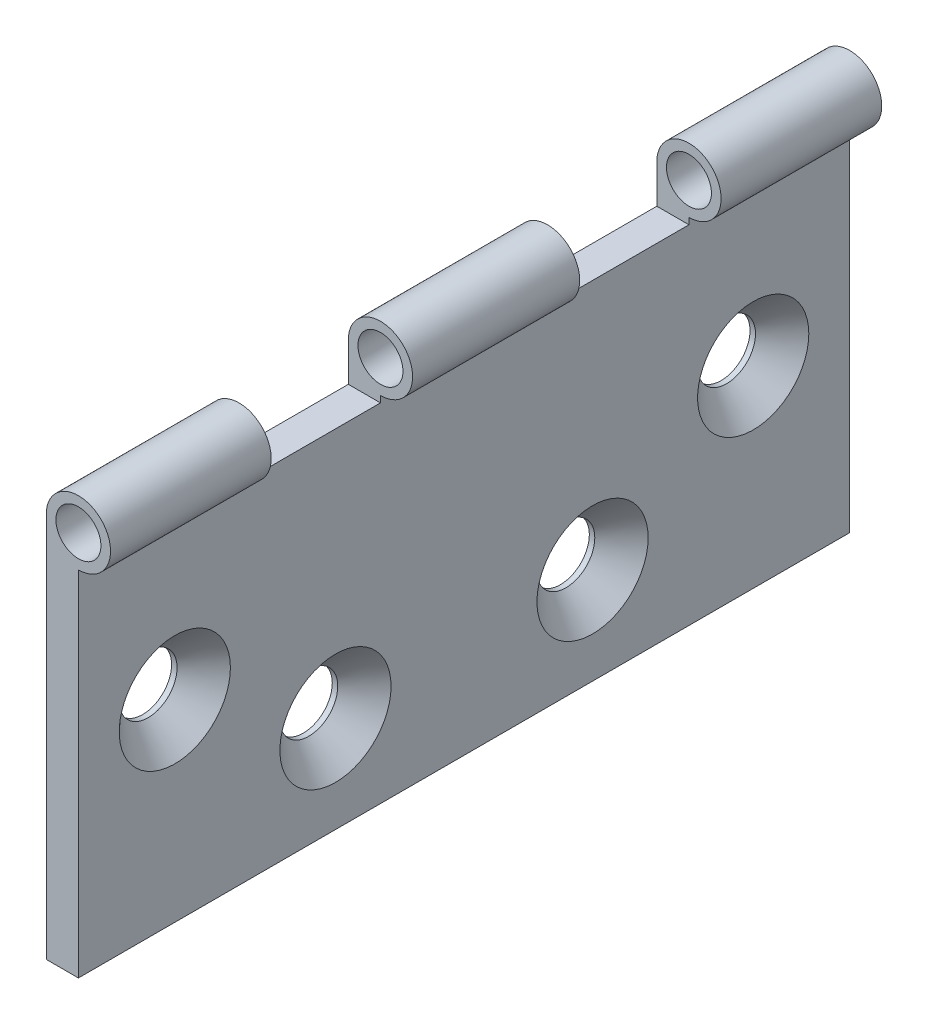
ISO-10303-21;
HEADER;
FILE_DESCRIPTION(('STEP AP214'),'2;1');
FILE_NAME('part.step','',(''),(''),'','','');
FILE_SCHEMA(('AUTOMOTIVE_DESIGN { 1 0 10303 214 1 1 1 1 }'));
ENDSEC;
DATA;
#1=APPLICATION_CONTEXT('core data for automotive mechanical design processes');
#2=APPLICATION_PROTOCOL_DEFINITION('international standard','automotive_design',2000,#1);
#3=PRODUCT_CONTEXT('',#1,'mechanical');
#4=PRODUCT('Part','Part','',(#3));
#5=PRODUCT_RELATED_PRODUCT_CATEGORY('part','',(#4));
#6=PRODUCT_DEFINITION_FORMATION('','',#4);
#7=PRODUCT_DEFINITION_CONTEXT('part definition',#1,'design');
#8=PRODUCT_DEFINITION('design','',#6,#7);
#9=PRODUCT_DEFINITION_SHAPE('','',#8);
#10=(LENGTH_UNIT() NAMED_UNIT(*) SI_UNIT(.MILLI.,.METRE.));
#11=(NAMED_UNIT(*) PLANE_ANGLE_UNIT() SI_UNIT($,.RADIAN.));
#12=(NAMED_UNIT(*) SI_UNIT($,.STERADIAN.) SOLID_ANGLE_UNIT());
#13=UNCERTAINTY_MEASURE_WITH_UNIT(LENGTH_MEASURE(1.E-05),#10,'distance_accuracy_value','');
#14=(GEOMETRIC_REPRESENTATION_CONTEXT(3) GLOBAL_UNCERTAINTY_ASSIGNED_CONTEXT((#13)) GLOBAL_UNIT_ASSIGNED_CONTEXT((#10,
#11,#12)) REPRESENTATION_CONTEXT('',''));
#15=CARTESIAN_POINT('',(0.,0.,0.));
#16=DIRECTION('',(0.,0.,1.));
#17=DIRECTION('',(1.,0.,0.));
#18=AXIS2_PLACEMENT_3D('',#15,#16,#17);
#19=CARTESIAN_POINT('',(5.,60.,-60.));
#20=DIRECTION('',(0.,0.,1.));
#21=DIRECTION('',(1.,0.,0.));
#22=AXIS2_PLACEMENT_3D('',#19,#20,#21);
#23=CYLINDRICAL_SURFACE('',#22,5.);
#24=CARTESIAN_POINT('',(5.,60.,-35.));
#25=DIRECTION('',(0.,0.,-1.));
#26=DIRECTION('',(0.,1.,0.));
#27=AXIS2_PLACEMENT_3D('',#24,#25,#26);
#28=CIRCLE('',#27,5.);
#29=CARTESIAN_POINT('',(5.,55.,-35.));
#30=VERTEX_POINT('',#29);
#31=CARTESIAN_POINT('',(0.,60.,-35.));
#32=VERTEX_POINT('',#31);
#33=EDGE_CURVE('E133',#30,#32,#28,.F.);
#34=ORIENTED_EDGE('',*,*,#33,.F.);
#35=DIRECTION('',(0.,0.,1.));
#36=VECTOR('',#35,1.);
#37=CARTESIAN_POINT('',(5.,55.,-60.));
#38=LINE('',#37,#36);
#39=CARTESIAN_POINT('',(5.,55.,-60.));
#40=VERTEX_POINT('',#39);
#41=EDGE_CURVE('E89',#40,#30,#38,.T.);
#42=ORIENTED_EDGE('',*,*,#41,.F.);
#43=CARTESIAN_POINT('',(5.,60.,-60.));
#44=DIRECTION('',(0.,0.,1.));
#45=DIRECTION('',(1.,0.,0.));
#46=AXIS2_PLACEMENT_3D('',#43,#44,#45);
#47=CIRCLE('',#46,5.);
#48=CARTESIAN_POINT('',(0.,60.,-60.));
#49=VERTEX_POINT('',#48);
#50=EDGE_CURVE('E87',#40,#49,#47,.T.);
#51=ORIENTED_EDGE('',*,*,#50,.T.);
#52=DIRECTION('',(0.,0.,-1.));
#53=VECTOR('',#52,1.);
#54=CARTESIAN_POINT('',(0.,60.,60.));
#55=LINE('',#54,#53);
#56=EDGE_CURVE('E47',#32,#49,#55,.T.);
#57=ORIENTED_EDGE('',*,*,#56,.F.);
#58=EDGE_LOOP('',(#34,#42,#51,#57));
#59=FACE_BOUND('',#58,.T.);
#60=ADVANCED_FACE('F35',(#59),#23,.T.);
#61=CARTESIAN_POINT('',(5.,60.,-60.));
#62=DIRECTION('',(0.,0.,1.));
#63=DIRECTION('',(1.,0.,0.));
#64=AXIS2_PLACEMENT_3D('',#61,#62,#63);
#65=CYLINDRICAL_SURFACE('',#64,3.5);
#66=CARTESIAN_POINT('',(5.,60.,-35.));
#67=DIRECTION('',(0.,0.,-1.));
#68=DIRECTION('',(0.,1.,0.));
#69=AXIS2_PLACEMENT_3D('',#66,#67,#68);
#70=CIRCLE('',#69,3.5);
#71=CARTESIAN_POINT('',(5.,63.5,-35.));
#72=VERTEX_POINT('',#71);
#73=EDGE_CURVE('E39',#72,#72,#70,.F.);
#74=ORIENTED_EDGE('',*,*,#73,.T.);
#75=EDGE_LOOP('',(#74));
#76=FACE_BOUND('',#75,.T.);
#77=CARTESIAN_POINT('',(5.,60.,-60.));
#78=DIRECTION('',(0.,0.,1.));
#79=DIRECTION('',(1.,0.,0.));
#80=AXIS2_PLACEMENT_3D('',#77,#78,#79);
#81=CIRCLE('',#80,3.5);
#82=CARTESIAN_POINT('',(8.5,60.,-60.));
#83=VERTEX_POINT('',#82);
#84=EDGE_CURVE('E204',#83,#83,#81,.T.);
#85=ORIENTED_EDGE('',*,*,#84,.F.);
#86=EDGE_LOOP('',(#85));
#87=FACE_BOUND('',#86,.T.);
#88=ADVANCED_FACE('F305',(#76,#87),#65,.F.);
#89=CARTESIAN_POINT('',(5.,60.,35.));
#90=DIRECTION('',(0.,0.,1.));
#91=DIRECTION('',(0.,-1.,0.));
#92=AXIS2_PLACEMENT_3D('',#89,#90,#91);
#93=CIRCLE('',#92,5.);
#94=CARTESIAN_POINT('',(0.,60.,35.));
#95=VERTEX_POINT('',#94);
#96=CARTESIAN_POINT('',(5.,55.,35.));
#97=VERTEX_POINT('',#96);
#98=EDGE_CURVE('E105',#95,#97,#93,.F.);
#99=ORIENTED_EDGE('',*,*,#98,.F.);
#100=CARTESIAN_POINT('',(0.,60.,60.));
#101=VERTEX_POINT('',#100);
#102=EDGE_CURVE('E11',#101,#95,#55,.T.);
#103=ORIENTED_EDGE('',*,*,#102,.F.);
#104=CARTESIAN_POINT('',(5.,60.,60.));
#105=DIRECTION('',(0.,0.,1.));
#106=DIRECTION('',(1.,0.,0.));
#107=AXIS2_PLACEMENT_3D('',#104,#105,#106);
#108=CIRCLE('',#107,5.);
#109=CARTESIAN_POINT('',(5.,55.,60.));
#110=VERTEX_POINT('',#109);
#111=EDGE_CURVE('E207',#110,#101,#108,.T.);
#112=ORIENTED_EDGE('',*,*,#111,.F.);
#113=EDGE_CURVE('E211',#97,#110,#38,.T.);
#114=ORIENTED_EDGE('',*,*,#113,.F.);
#115=EDGE_LOOP('',(#99,#103,#112,#114));
#116=FACE_BOUND('',#115,.T.);
#117=ADVANCED_FACE('F307',(#116),#23,.T.);
#118=CARTESIAN_POINT('',(5.,60.,35.));
#119=DIRECTION('',(0.,0.,1.));
#120=DIRECTION('',(0.,-1.,0.));
#121=AXIS2_PLACEMENT_3D('',#118,#119,#120);
#122=CIRCLE('',#121,3.5);
#123=CARTESIAN_POINT('',(5.,56.5,35.));
#124=VERTEX_POINT('',#123);
#125=EDGE_CURVE('E103',#124,#124,#122,.F.);
#126=ORIENTED_EDGE('',*,*,#125,.T.);
#127=EDGE_LOOP('',(#126));
#128=FACE_BOUND('',#127,.T.);
#129=CARTESIAN_POINT('',(5.,60.,60.));
#130=DIRECTION('',(0.,0.,1.));
#131=DIRECTION('',(1.,0.,0.));
#132=AXIS2_PLACEMENT_3D('',#129,#130,#131);
#133=CIRCLE('',#132,3.5);
#134=CARTESIAN_POINT('',(8.5,60.,60.));
#135=VERTEX_POINT('',#134);
#136=EDGE_CURVE('E203',#135,#135,#133,.T.);
#137=ORIENTED_EDGE('',*,*,#136,.T.);
#138=EDGE_LOOP('',(#137));
#139=FACE_BOUND('',#138,.T.);
#140=ADVANCED_FACE('F314',(#128,#139),#65,.F.);
#141=CARTESIAN_POINT('',(5.,0.,60.));
#142=DIRECTION('',(-1.,0.,0.));
#143=DIRECTION('',(0.,0.,1.));
#144=AXIS2_PLACEMENT_3D('',#141,#142,#143);
#145=PLANE('',#144);
#146=CARTESIAN_POINT('',(5.,30.,-45.));
#147=DIRECTION('',(1.,0.,0.));
#148=DIRECTION('',(0.,0.,-1.));
#149=AXIS2_PLACEMENT_3D('',#146,#147,#148);
#150=CIRCLE('',#149,8.65);
#151=CARTESIAN_POINT('',(5.,30.,-53.65));
#152=VERTEX_POINT('',#151);
#153=EDGE_CURVE('E167',#152,#152,#150,.T.);
#154=ORIENTED_EDGE('',*,*,#153,.F.);
#155=EDGE_LOOP('',(#154));
#156=FACE_BOUND('',#155,.T.);
#157=CARTESIAN_POINT('',(5.,15.,-20.));
#158=DIRECTION('',(1.,0.,0.));
#159=DIRECTION('',(0.,0.,-1.));
#160=AXIS2_PLACEMENT_3D('',#157,#158,#159);
#161=CIRCLE('',#160,8.65);
#162=CARTESIAN_POINT('',(5.,15.,-28.65));
#163=VERTEX_POINT('',#162);
#164=EDGE_CURVE('E176',#163,#163,#161,.T.);
#165=ORIENTED_EDGE('',*,*,#164,.F.);
#166=EDGE_LOOP('',(#165));
#167=FACE_BOUND('',#166,.T.);
#168=CARTESIAN_POINT('',(5.,30.,45.));
#169=DIRECTION('',(1.,0.,0.));
#170=DIRECTION('',(0.,0.,-1.));
#171=AXIS2_PLACEMENT_3D('',#168,#169,#170);
#172=CIRCLE('',#171,8.65);
#173=CARTESIAN_POINT('',(5.,30.,36.35));
#174=VERTEX_POINT('',#173);
#175=EDGE_CURVE('E185',#174,#174,#172,.T.);
#176=ORIENTED_EDGE('',*,*,#175,.F.);
#177=EDGE_LOOP('',(#176));
#178=FACE_BOUND('',#177,.T.);
#179=CARTESIAN_POINT('',(5.,15.,20.));
#180=DIRECTION('',(1.,0.,0.));
#181=DIRECTION('',(0.,0.,-1.));
#182=AXIS2_PLACEMENT_3D('',#179,#180,#181);
#183=CIRCLE('',#182,8.65);
#184=CARTESIAN_POINT('',(5.,15.,11.35));
#185=VERTEX_POINT('',#184);
#186=EDGE_CURVE('E194',#185,#185,#183,.T.);
#187=ORIENTED_EDGE('',*,*,#186,.F.);
#188=EDGE_LOOP('',(#187));
#189=FACE_BOUND('',#188,.T.);
#190=ORIENTED_EDGE('',*,*,#41,.T.);
#191=DIRECTION('',(0.,-1.,0.));
#192=VECTOR('',#191,1.);
#193=CARTESIAN_POINT('',(5.,0.,-35.));
#194=LINE('',#193,#192);
#195=CARTESIAN_POINT('',(5.,54.,-35.));
#196=VERTEX_POINT('',#195);
#197=EDGE_CURVE('E136',#30,#196,#194,.T.);
#198=ORIENTED_EDGE('',*,*,#197,.T.);
#199=DIRECTION('',(0.,0.,1.));
#200=VECTOR('',#199,1.);
#201=CARTESIAN_POINT('',(5.,54.,60.));
#202=LINE('',#201,#200);
#203=CARTESIAN_POINT('',(5.,54.,-13.));
#204=VERTEX_POINT('',#203);
#205=EDGE_CURVE('E138',#196,#204,#202,.T.);
#206=ORIENTED_EDGE('',*,*,#205,.T.);
#207=DIRECTION('',(0.,1.,0.));
#208=VECTOR('',#207,1.);
#209=CARTESIAN_POINT('',(5.,0.,-13.));
#210=LINE('',#209,#208);
#211=CARTESIAN_POINT('',(5.,55.,-13.));
#212=VERTEX_POINT('',#211);
#213=EDGE_CURVE('E114',#204,#212,#210,.T.);
#214=ORIENTED_EDGE('',*,*,#213,.T.);
#215=CARTESIAN_POINT('',(5.,55.,13.));
#216=VERTEX_POINT('',#215);
#217=EDGE_CURVE('E214',#212,#216,#38,.T.);
#218=ORIENTED_EDGE('',*,*,#217,.T.);
#219=DIRECTION('',(0.,-1.,0.));
#220=VECTOR('',#219,1.);
#221=CARTESIAN_POINT('',(5.,0.,13.));
#222=LINE('',#221,#220);
#223=CARTESIAN_POINT('',(5.,54.,13.));
#224=VERTEX_POINT('',#223);
#225=EDGE_CURVE('E106',#216,#224,#222,.T.);
#226=ORIENTED_EDGE('',*,*,#225,.T.);
#227=DIRECTION('',(0.,0.,1.));
#228=VECTOR('',#227,1.);
#229=CARTESIAN_POINT('',(5.,54.,60.));
#230=LINE('',#229,#228);
#231=CARTESIAN_POINT('',(5.,54.,35.));
#232=VERTEX_POINT('',#231);
#233=EDGE_CURVE('E164',#224,#232,#230,.T.);
#234=ORIENTED_EDGE('',*,*,#233,.T.);
#235=DIRECTION('',(0.,1.,0.));
#236=VECTOR('',#235,1.);
#237=CARTESIAN_POINT('',(5.,0.,35.));
#238=LINE('',#237,#236);
#239=EDGE_CURVE('E161',#232,#97,#238,.T.);
#240=ORIENTED_EDGE('',*,*,#239,.T.);
#241=ORIENTED_EDGE('',*,*,#113,.T.);
#242=DIRECTION('',(0.,1.,0.));
#243=VECTOR('',#242,1.);
#244=CARTESIAN_POINT('',(5.,0.,60.));
#245=LINE('',#244,#243);
#246=CARTESIAN_POINT('',(5.,0.,60.));
#247=VERTEX_POINT('',#246);
#248=EDGE_CURVE('E76',#247,#110,#245,.T.);
#249=ORIENTED_EDGE('',*,*,#248,.F.);
#250=DIRECTION('',(0.,0.,-1.));
#251=VECTOR('',#250,1.);
#252=CARTESIAN_POINT('',(5.,0.,60.));
#253=LINE('',#252,#251);
#254=CARTESIAN_POINT('',(5.,0.,-60.));
#255=VERTEX_POINT('',#254);
#256=EDGE_CURVE('E55',#247,#255,#253,.T.);
#257=ORIENTED_EDGE('',*,*,#256,.T.);
#258=DIRECTION('',(0.,1.,0.));
#259=VECTOR('',#258,1.);
#260=CARTESIAN_POINT('',(5.,0.,-60.));
#261=LINE('',#260,#259);
#262=EDGE_CURVE('E73',#255,#40,#261,.T.);
#263=ORIENTED_EDGE('',*,*,#262,.T.);
#264=EDGE_LOOP('',(#190,#198,#206,#214,#218,#226,#234,#240,#241,#249,#257,#263));
#265=FACE_BOUND('',#264,.T.);
#266=ADVANCED_FACE('F37',(#156,#167,#178,#189,#265),#145,.F.);
#267=CARTESIAN_POINT('',(0.,0.,60.));
#268=DIRECTION('',(-1.,0.,0.));
#269=DIRECTION('',(0.,0.,1.));
#270=AXIS2_PLACEMENT_3D('',#267,#268,#269);
#271=PLANE('',#270);
#272=DIRECTION('',(0.,1.,0.));
#273=VECTOR('',#272,1.);
#274=CARTESIAN_POINT('',(0.,65.,-35.));
#275=LINE('',#274,#273);
#276=CARTESIAN_POINT('',(0.,54.,-35.));
#277=VERTEX_POINT('',#276);
#278=EDGE_CURVE('E286',#277,#32,#275,.T.);
#279=ORIENTED_EDGE('',*,*,#278,.T.);
#280=ORIENTED_EDGE('',*,*,#56,.T.);
#281=DIRECTION('',(0.,1.,0.));
#282=VECTOR('',#281,1.);
#283=CARTESIAN_POINT('',(0.,0.,-60.));
#284=LINE('',#283,#282);
#285=CARTESIAN_POINT('',(0.,0.,-60.));
#286=VERTEX_POINT('',#285);
#287=EDGE_CURVE('E88',#286,#49,#284,.T.);
#288=ORIENTED_EDGE('',*,*,#287,.F.);
#289=DIRECTION('',(0.,0.,-1.));
#290=VECTOR('',#289,1.);
#291=CARTESIAN_POINT('',(0.,0.,60.));
#292=LINE('',#291,#290);
#293=CARTESIAN_POINT('',(0.,0.,60.));
#294=VERTEX_POINT('',#293);
#295=EDGE_CURVE('E66',#294,#286,#292,.T.);
#296=ORIENTED_EDGE('',*,*,#295,.F.);
#297=DIRECTION('',(0.,1.,0.));
#298=VECTOR('',#297,1.);
#299=CARTESIAN_POINT('',(0.,0.,60.));
#300=LINE('',#299,#298);
#301=EDGE_CURVE('E93',#294,#101,#300,.T.);
#302=ORIENTED_EDGE('',*,*,#301,.T.);
#303=ORIENTED_EDGE('',*,*,#102,.T.);
#304=DIRECTION('',(0.,-1.,0.));
#305=VECTOR('',#304,1.);
#306=CARTESIAN_POINT('',(0.,65.,35.));
#307=LINE('',#306,#305);
#308=CARTESIAN_POINT('',(0.,54.,35.));
#309=VERTEX_POINT('',#308);
#310=EDGE_CURVE('E141',#95,#309,#307,.T.);
#311=ORIENTED_EDGE('',*,*,#310,.T.);
#312=DIRECTION('',(0.,0.,-1.));
#313=VECTOR('',#312,1.);
#314=CARTESIAN_POINT('',(0.,54.,13.));
#315=LINE('',#314,#313);
#316=CARTESIAN_POINT('',(0.,54.,13.));
#317=VERTEX_POINT('',#316);
#318=EDGE_CURVE('E144',#309,#317,#315,.T.);
#319=ORIENTED_EDGE('',*,*,#318,.T.);
#320=DIRECTION('',(0.,1.,0.));
#321=VECTOR('',#320,1.);
#322=CARTESIAN_POINT('',(0.,65.,13.));
#323=LINE('',#322,#321);
#324=CARTESIAN_POINT('',(0.,60.,13.));
#325=VERTEX_POINT('',#324);
#326=EDGE_CURVE('E147',#317,#325,#323,.T.);
#327=ORIENTED_EDGE('',*,*,#326,.T.);
#328=CARTESIAN_POINT('',(0.,60.,-13.));
#329=VERTEX_POINT('',#328);
#330=EDGE_CURVE('E45',#325,#329,#55,.T.);
#331=ORIENTED_EDGE('',*,*,#330,.T.);
#332=DIRECTION('',(0.,-1.,0.));
#333=VECTOR('',#332,1.);
#334=CARTESIAN_POINT('',(0.,65.,-13.));
#335=LINE('',#334,#333);
#336=CARTESIAN_POINT('',(0.,54.,-13.));
#337=VERTEX_POINT('',#336);
#338=EDGE_CURVE('E279',#329,#337,#335,.T.);
#339=ORIENTED_EDGE('',*,*,#338,.T.);
#340=DIRECTION('',(0.,0.,-1.));
#341=VECTOR('',#340,1.);
#342=CARTESIAN_POINT('',(0.,54.,-35.));
#343=LINE('',#342,#341);
#344=EDGE_CURVE('E126',#337,#277,#343,.T.);
#345=ORIENTED_EDGE('',*,*,#344,.T.);
#346=EDGE_LOOP('',(#279,#280,#288,#296,#302,#303,#311,#319,#327,#331,#339,#345));
#347=FACE_BOUND('',#346,.T.);
#348=CARTESIAN_POINT('',(0.,30.,-45.));
#349=DIRECTION('',(1.,0.,0.));
#350=DIRECTION('',(0.,0.,-1.));
#351=AXIS2_PLACEMENT_3D('',#348,#349,#350);
#352=CIRCLE('',#351,4.5);
#353=CARTESIAN_POINT('',(0.,30.,-49.5));
#354=VERTEX_POINT('',#353);
#355=EDGE_CURVE('E173',#354,#354,#352,.T.);
#356=ORIENTED_EDGE('',*,*,#355,.T.);
#357=EDGE_LOOP('',(#356));
#358=FACE_BOUND('',#357,.T.);
#359=CARTESIAN_POINT('',(0.,15.,-20.));
#360=DIRECTION('',(1.,0.,0.));
#361=DIRECTION('',(0.,0.,-1.));
#362=AXIS2_PLACEMENT_3D('',#359,#360,#361);
#363=CIRCLE('',#362,4.5);
#364=CARTESIAN_POINT('',(0.,15.,-24.5));
#365=VERTEX_POINT('',#364);
#366=EDGE_CURVE('E182',#365,#365,#363,.T.);
#367=ORIENTED_EDGE('',*,*,#366,.T.);
#368=EDGE_LOOP('',(#367));
#369=FACE_BOUND('',#368,.T.);
#370=CARTESIAN_POINT('',(0.,30.,45.));
#371=DIRECTION('',(1.,0.,0.));
#372=DIRECTION('',(0.,0.,-1.));
#373=AXIS2_PLACEMENT_3D('',#370,#371,#372);
#374=CIRCLE('',#373,4.5);
#375=CARTESIAN_POINT('',(0.,30.,40.5));
#376=VERTEX_POINT('',#375);
#377=EDGE_CURVE('E191',#376,#376,#374,.T.);
#378=ORIENTED_EDGE('',*,*,#377,.T.);
#379=EDGE_LOOP('',(#378));
#380=FACE_BOUND('',#379,.T.);
#381=CARTESIAN_POINT('',(0.,15.,20.));
#382=DIRECTION('',(1.,0.,0.));
#383=DIRECTION('',(0.,0.,-1.));
#384=AXIS2_PLACEMENT_3D('',#381,#382,#383);
#385=CIRCLE('',#384,4.5);
#386=CARTESIAN_POINT('',(0.,15.,15.5));
#387=VERTEX_POINT('',#386);
#388=EDGE_CURVE('E200',#387,#387,#385,.T.);
#389=ORIENTED_EDGE('',*,*,#388,.T.);
#390=EDGE_LOOP('',(#389));
#391=FACE_BOUND('',#390,.T.);
#392=ADVANCED_FACE('F225',(#347,#358,#369,#380,#391),#271,.T.);
#393=CARTESIAN_POINT('',(5.,0.,60.));
#394=DIRECTION('',(0.,-1.,0.));
#395=DIRECTION('',(0.,0.,-1.));
#396=AXIS2_PLACEMENT_3D('',#393,#394,#395);
#397=PLANE('',#396);
#398=DIRECTION('',(-1.,0.,0.));
#399=VECTOR('',#398,1.);
#400=CARTESIAN_POINT('',(5.,0.,-60.));
#401=LINE('',#400,#399);
#402=EDGE_CURVE('E85',#255,#286,#401,.T.);
#403=ORIENTED_EDGE('',*,*,#402,.F.);
#404=ORIENTED_EDGE('',*,*,#256,.F.);
#405=DIRECTION('',(-1.,0.,0.));
#406=VECTOR('',#405,1.);
#407=CARTESIAN_POINT('',(5.,0.,60.));
#408=LINE('',#407,#406);
#409=EDGE_CURVE('E78',#247,#294,#408,.T.);
#410=ORIENTED_EDGE('',*,*,#409,.T.);
#411=ORIENTED_EDGE('',*,*,#295,.T.);
#412=EDGE_LOOP('',(#403,#404,#410,#411));
#413=FACE_BOUND('',#412,.T.);
#414=ADVANCED_FACE('F91',(#413),#397,.T.);
#415=CARTESIAN_POINT('',(0.,0.,60.));
#416=DIRECTION('',(0.,0.,-1.));
#417=DIRECTION('',(-1.,0.,0.));
#418=AXIS2_PLACEMENT_3D('',#415,#416,#417);
#419=PLANE('',#418);
#420=ORIENTED_EDGE('',*,*,#136,.F.);
#421=EDGE_LOOP('',(#420));
#422=FACE_BOUND('',#421,.T.);
#423=ORIENTED_EDGE('',*,*,#248,.T.);
#424=ORIENTED_EDGE('',*,*,#111,.T.);
#425=ORIENTED_EDGE('',*,*,#301,.F.);
#426=ORIENTED_EDGE('',*,*,#409,.F.);
#427=EDGE_LOOP('',(#423,#424,#425,#426));
#428=FACE_BOUND('',#427,.T.);
#429=ADVANCED_FACE('F220',(#422,#428),#419,.F.);
#430=CARTESIAN_POINT('',(0.,0.,-60.));
#431=DIRECTION('',(0.,0.,-1.));
#432=DIRECTION('',(-1.,0.,0.));
#433=AXIS2_PLACEMENT_3D('',#430,#431,#432);
#434=PLANE('',#433);
#435=ORIENTED_EDGE('',*,*,#84,.T.);
#436=EDGE_LOOP('',(#435));
#437=FACE_BOUND('',#436,.T.);
#438=ORIENTED_EDGE('',*,*,#287,.T.);
#439=ORIENTED_EDGE('',*,*,#50,.F.);
#440=ORIENTED_EDGE('',*,*,#262,.F.);
#441=ORIENTED_EDGE('',*,*,#402,.T.);
#442=EDGE_LOOP('',(#438,#439,#440,#441));
#443=FACE_BOUND('',#442,.T.);
#444=ADVANCED_FACE('F84',(#437,#443),#434,.T.);
#445=ORIENTED_EDGE('',*,*,#217,.F.);
#446=CARTESIAN_POINT('',(5.,60.,-13.));
#447=DIRECTION('',(0.,0.,1.));
#448=DIRECTION('',(1.,0.,0.));
#449=AXIS2_PLACEMENT_3D('',#446,#447,#448);
#450=CIRCLE('',#449,5.);
#451=EDGE_CURVE('E109',#329,#212,#450,.F.);
#452=ORIENTED_EDGE('',*,*,#451,.F.);
#453=ORIENTED_EDGE('',*,*,#330,.F.);
#454=CARTESIAN_POINT('',(5.,60.,13.));
#455=DIRECTION('',(0.,0.,-1.));
#456=DIRECTION('',(-1.,0.,0.));
#457=AXIS2_PLACEMENT_3D('',#454,#455,#456);
#458=CIRCLE('',#457,5.);
#459=EDGE_CURVE('E101',#216,#325,#458,.F.);
#460=ORIENTED_EDGE('',*,*,#459,.F.);
#461=EDGE_LOOP('',(#445,#452,#453,#460));
#462=FACE_BOUND('',#461,.T.);
#463=ADVANCED_FACE('F308',(#462),#23,.T.);
#464=CARTESIAN_POINT('',(5.,60.,-13.));
#465=DIRECTION('',(0.,0.,1.));
#466=DIRECTION('',(1.,0.,0.));
#467=AXIS2_PLACEMENT_3D('',#464,#465,#466);
#468=CIRCLE('',#467,3.5);
#469=CARTESIAN_POINT('',(8.5,60.,-13.));
#470=VERTEX_POINT('',#469);
#471=EDGE_CURVE('E107',#470,#470,#468,.F.);
#472=ORIENTED_EDGE('',*,*,#471,.T.);
#473=EDGE_LOOP('',(#472));
#474=FACE_BOUND('',#473,.T.);
#475=CARTESIAN_POINT('',(5.,60.,13.));
#476=DIRECTION('',(0.,0.,-1.));
#477=DIRECTION('',(-1.,0.,0.));
#478=AXIS2_PLACEMENT_3D('',#475,#476,#477);
#479=CIRCLE('',#478,3.5);
#480=CARTESIAN_POINT('',(1.5,60.,13.));
#481=VERTEX_POINT('',#480);
#482=EDGE_CURVE('E98',#481,#481,#479,.F.);
#483=ORIENTED_EDGE('',*,*,#482,.T.);
#484=EDGE_LOOP('',(#483));
#485=FACE_BOUND('',#484,.T.);
#486=ADVANCED_FACE('F315',(#474,#485),#65,.F.);
#487=CARTESIAN_POINT('',(5.,15.,20.));
#488=DIRECTION('',(1.,0.,0.));
#489=DIRECTION('',(0.,0.,-1.));
#490=AXIS2_PLACEMENT_3D('',#487,#488,#489);
#491=CYLINDRICAL_SURFACE('',#490,4.5);
#492=ORIENTED_EDGE('',*,*,#388,.F.);
#493=EDGE_LOOP('',(#492));
#494=FACE_BOUND('',#493,.T.);
#495=CARTESIAN_POINT('',(0.850000000000003,15.,20.));
#496=DIRECTION('',(1.,0.,0.));
#497=DIRECTION('',(0.,0.,-1.));
#498=AXIS2_PLACEMENT_3D('',#495,#496,#497);
#499=CIRCLE('',#498,4.5);
#500=CARTESIAN_POINT('',(0.850000000000003,15.,15.5));
#501=VERTEX_POINT('',#500);
#502=EDGE_CURVE('E197',#501,#501,#499,.T.);
#503=ORIENTED_EDGE('',*,*,#502,.T.);
#504=EDGE_LOOP('',(#503));
#505=FACE_BOUND('',#504,.T.);
#506=ADVANCED_FACE('F324',(#494,#505),#491,.F.);
#507=CARTESIAN_POINT('',(5.,15.,20.));
#508=DIRECTION('',(1.,0.,0.));
#509=DIRECTION('',(0.,0.,-1.));
#510=AXIS2_PLACEMENT_3D('',#507,#508,#509);
#511=CONICAL_SURFACE('',#510,8.65,0.785398163397448);
#512=ORIENTED_EDGE('',*,*,#502,.F.);
#513=EDGE_LOOP('',(#512));
#514=FACE_BOUND('',#513,.T.);
#515=ORIENTED_EDGE('',*,*,#186,.T.);
#516=EDGE_LOOP('',(#515));
#517=FACE_BOUND('',#516,.T.);
#518=ADVANCED_FACE('F372',(#514,#517),#511,.F.);
#519=CARTESIAN_POINT('',(5.,30.,45.));
#520=DIRECTION('',(1.,0.,0.));
#521=DIRECTION('',(0.,0.,-1.));
#522=AXIS2_PLACEMENT_3D('',#519,#520,#521);
#523=CYLINDRICAL_SURFACE('',#522,4.5);
#524=ORIENTED_EDGE('',*,*,#377,.F.);
#525=EDGE_LOOP('',(#524));
#526=FACE_BOUND('',#525,.T.);
#527=CARTESIAN_POINT('',(0.850000000000003,30.,45.));
#528=DIRECTION('',(1.,0.,0.));
#529=DIRECTION('',(0.,0.,-1.));
#530=AXIS2_PLACEMENT_3D('',#527,#528,#529);
#531=CIRCLE('',#530,4.5);
#532=CARTESIAN_POINT('',(0.850000000000003,30.,40.5));
#533=VERTEX_POINT('',#532);
#534=EDGE_CURVE('E188',#533,#533,#531,.T.);
#535=ORIENTED_EDGE('',*,*,#534,.T.);
#536=EDGE_LOOP('',(#535));
#537=FACE_BOUND('',#536,.T.);
#538=ADVANCED_FACE('F368',(#526,#537),#523,.F.);
#539=CARTESIAN_POINT('',(5.,30.,45.));
#540=DIRECTION('',(1.,0.,0.));
#541=DIRECTION('',(0.,0.,-1.));
#542=AXIS2_PLACEMENT_3D('',#539,#540,#541);
#543=CONICAL_SURFACE('',#542,8.65,0.785398163397449);
#544=ORIENTED_EDGE('',*,*,#534,.F.);
#545=EDGE_LOOP('',(#544));
#546=FACE_BOUND('',#545,.T.);
#547=ORIENTED_EDGE('',*,*,#175,.T.);
#548=EDGE_LOOP('',(#547));
#549=FACE_BOUND('',#548,.T.);
#550=ADVANCED_FACE('F364',(#546,#549),#543,.F.);
#551=CARTESIAN_POINT('',(5.,15.,-20.));
#552=DIRECTION('',(1.,0.,0.));
#553=DIRECTION('',(0.,0.,-1.));
#554=AXIS2_PLACEMENT_3D('',#551,#552,#553);
#555=CYLINDRICAL_SURFACE('',#554,4.5);
#556=ORIENTED_EDGE('',*,*,#366,.F.);
#557=EDGE_LOOP('',(#556));
#558=FACE_BOUND('',#557,.T.);
#559=CARTESIAN_POINT('',(0.850000000000003,15.,-20.));
#560=DIRECTION('',(1.,0.,0.));
#561=DIRECTION('',(0.,0.,-1.));
#562=AXIS2_PLACEMENT_3D('',#559,#560,#561);
#563=CIRCLE('',#562,4.5);
#564=CARTESIAN_POINT('',(0.850000000000003,15.,-24.5));
#565=VERTEX_POINT('',#564);
#566=EDGE_CURVE('E179',#565,#565,#563,.T.);
#567=ORIENTED_EDGE('',*,*,#566,.T.);
#568=EDGE_LOOP('',(#567));
#569=FACE_BOUND('',#568,.T.);
#570=ADVANCED_FACE('F360',(#558,#569),#555,.F.);
#571=CARTESIAN_POINT('',(5.,15.,-20.));
#572=DIRECTION('',(1.,0.,0.));
#573=DIRECTION('',(0.,0.,-1.));
#574=AXIS2_PLACEMENT_3D('',#571,#572,#573);
#575=CONICAL_SURFACE('',#574,8.65,0.785398163397448);
#576=ORIENTED_EDGE('',*,*,#566,.F.);
#577=EDGE_LOOP('',(#576));
#578=FACE_BOUND('',#577,.T.);
#579=ORIENTED_EDGE('',*,*,#164,.T.);
#580=EDGE_LOOP('',(#579));
#581=FACE_BOUND('',#580,.T.);
#582=ADVANCED_FACE('F356',(#578,#581),#575,.F.);
#583=CARTESIAN_POINT('',(5.,30.,-45.));
#584=DIRECTION('',(1.,0.,0.));
#585=DIRECTION('',(0.,0.,-1.));
#586=AXIS2_PLACEMENT_3D('',#583,#584,#585);
#587=CYLINDRICAL_SURFACE('',#586,4.5);
#588=ORIENTED_EDGE('',*,*,#355,.F.);
#589=EDGE_LOOP('',(#588));
#590=FACE_BOUND('',#589,.T.);
#591=CARTESIAN_POINT('',(0.850000000000003,30.,-45.));
#592=DIRECTION('',(1.,0.,0.));
#593=DIRECTION('',(0.,0.,-1.));
#594=AXIS2_PLACEMENT_3D('',#591,#592,#593);
#595=CIRCLE('',#594,4.5);
#596=CARTESIAN_POINT('',(0.850000000000003,30.,-49.5));
#597=VERTEX_POINT('',#596);
#598=EDGE_CURVE('E170',#597,#597,#595,.T.);
#599=ORIENTED_EDGE('',*,*,#598,.T.);
#600=EDGE_LOOP('',(#599));
#601=FACE_BOUND('',#600,.T.);
#602=ADVANCED_FACE('F352',(#590,#601),#587,.F.);
#603=CARTESIAN_POINT('',(5.,30.,-45.));
#604=DIRECTION('',(1.,0.,0.));
#605=DIRECTION('',(0.,0.,-1.));
#606=AXIS2_PLACEMENT_3D('',#603,#604,#605);
#607=CONICAL_SURFACE('',#606,8.65,0.785398163397449);
#608=ORIENTED_EDGE('',*,*,#598,.F.);
#609=EDGE_LOOP('',(#608));
#610=FACE_BOUND('',#609,.T.);
#611=ORIENTED_EDGE('',*,*,#153,.T.);
#612=EDGE_LOOP('',(#611));
#613=FACE_BOUND('',#612,.T.);
#614=ADVANCED_FACE('F348',(#610,#613),#607,.F.);
#615=CARTESIAN_POINT('',(0.,54.,13.));
#616=DIRECTION('',(0.,-1.,0.));
#617=DIRECTION('',(0.,0.,-1.));
#618=AXIS2_PLACEMENT_3D('',#615,#616,#617);
#619=PLANE('',#618);
#620=DIRECTION('',(1.,0.,0.));
#621=VECTOR('',#620,1.);
#622=CARTESIAN_POINT('',(0.,54.,13.));
#623=LINE('',#622,#621);
#624=EDGE_CURVE('E102',#317,#224,#623,.T.);
#625=ORIENTED_EDGE('',*,*,#624,.F.);
#626=ORIENTED_EDGE('',*,*,#318,.F.);
#627=DIRECTION('',(1.,0.,0.));
#628=VECTOR('',#627,1.);
#629=CARTESIAN_POINT('',(0.,54.,35.));
#630=LINE('',#629,#628);
#631=EDGE_CURVE('E150',#309,#232,#630,.T.);
#632=ORIENTED_EDGE('',*,*,#631,.T.);
#633=ORIENTED_EDGE('',*,*,#233,.F.);
#634=EDGE_LOOP('',(#625,#626,#632,#633));
#635=FACE_BOUND('',#634,.T.);
#636=ADVANCED_FACE('F336',(#635),#619,.F.);
#637=CARTESIAN_POINT('',(0.,65.,35.));
#638=DIRECTION('',(0.,0.,1.));
#639=DIRECTION('',(0.,-1.,0.));
#640=AXIS2_PLACEMENT_3D('',#637,#638,#639);
#641=PLANE('',#640);
#642=ORIENTED_EDGE('',*,*,#125,.F.);
#643=EDGE_LOOP('',(#642));
#644=FACE_BOUND('',#643,.T.);
#645=ORIENTED_EDGE('',*,*,#631,.F.);
#646=ORIENTED_EDGE('',*,*,#310,.F.);
#647=ORIENTED_EDGE('',*,*,#98,.T.);
#648=ORIENTED_EDGE('',*,*,#239,.F.);
#649=EDGE_LOOP('',(#645,#646,#647,#648));
#650=FACE_BOUND('',#649,.T.);
#651=ADVANCED_FACE('F332',(#644,#650),#641,.F.);
#652=CARTESIAN_POINT('',(0.,65.,13.));
#653=DIRECTION('',(0.,0.,-1.));
#654=DIRECTION('',(-1.,0.,0.));
#655=AXIS2_PLACEMENT_3D('',#652,#653,#654);
#656=PLANE('',#655);
#657=ORIENTED_EDGE('',*,*,#482,.F.);
#658=EDGE_LOOP('',(#657));
#659=FACE_BOUND('',#658,.T.);
#660=ORIENTED_EDGE('',*,*,#225,.F.);
#661=ORIENTED_EDGE('',*,*,#459,.T.);
#662=ORIENTED_EDGE('',*,*,#326,.F.);
#663=ORIENTED_EDGE('',*,*,#624,.T.);
#664=EDGE_LOOP('',(#660,#661,#662,#663));
#665=FACE_BOUND('',#664,.T.);
#666=ADVANCED_FACE('F300',(#659,#665),#656,.F.);
#667=CARTESIAN_POINT('',(0.,54.,-35.));
#668=DIRECTION('',(0.,-1.,0.));
#669=DIRECTION('',(0.,0.,-1.));
#670=AXIS2_PLACEMENT_3D('',#667,#668,#669);
#671=PLANE('',#670);
#672=DIRECTION('',(1.,0.,0.));
#673=VECTOR('',#672,1.);
#674=CARTESIAN_POINT('',(0.,54.,-35.));
#675=LINE('',#674,#673);
#676=EDGE_CURVE('E110',#277,#196,#675,.T.);
#677=ORIENTED_EDGE('',*,*,#676,.F.);
#678=ORIENTED_EDGE('',*,*,#344,.F.);
#679=DIRECTION('',(1.,0.,0.));
#680=VECTOR('',#679,1.);
#681=CARTESIAN_POINT('',(0.,54.,-13.));
#682=LINE('',#681,#680);
#683=EDGE_CURVE('E117',#337,#204,#682,.T.);
#684=ORIENTED_EDGE('',*,*,#683,.T.);
#685=ORIENTED_EDGE('',*,*,#205,.F.);
#686=EDGE_LOOP('',(#677,#678,#684,#685));
#687=FACE_BOUND('',#686,.T.);
#688=ADVANCED_FACE('F283',(#687),#671,.F.);
#689=CARTESIAN_POINT('',(0.,65.,-35.));
#690=DIRECTION('',(0.,0.,-1.));
#691=DIRECTION('',(0.,1.,0.));
#692=AXIS2_PLACEMENT_3D('',#689,#690,#691);
#693=PLANE('',#692);
#694=ORIENTED_EDGE('',*,*,#73,.F.);
#695=EDGE_LOOP('',(#694));
#696=FACE_BOUND('',#695,.T.);
#697=ORIENTED_EDGE('',*,*,#197,.F.);
#698=ORIENTED_EDGE('',*,*,#33,.T.);
#699=ORIENTED_EDGE('',*,*,#278,.F.);
#700=ORIENTED_EDGE('',*,*,#676,.T.);
#701=EDGE_LOOP('',(#697,#698,#699,#700));
#702=FACE_BOUND('',#701,.T.);
#703=ADVANCED_FACE('F290',(#696,#702),#693,.F.);
#704=CARTESIAN_POINT('',(0.,65.,-13.));
#705=DIRECTION('',(0.,0.,1.));
#706=DIRECTION('',(1.,0.,0.));
#707=AXIS2_PLACEMENT_3D('',#704,#705,#706);
#708=PLANE('',#707);
#709=ORIENTED_EDGE('',*,*,#471,.F.);
#710=EDGE_LOOP('',(#709));
#711=FACE_BOUND('',#710,.T.);
#712=ORIENTED_EDGE('',*,*,#683,.F.);
#713=ORIENTED_EDGE('',*,*,#338,.F.);
#714=ORIENTED_EDGE('',*,*,#451,.T.);
#715=ORIENTED_EDGE('',*,*,#213,.F.);
#716=EDGE_LOOP('',(#712,#713,#714,#715));
#717=FACE_BOUND('',#716,.T.);
#718=ADVANCED_FACE('F277',(#711,#717),#708,.F.);
#719=CLOSED_SHELL('',(#60,#88,#117,#140,#266,#392,#414,#429,#444,#463,#486,#506,#518,#538,#550,
#570,#582,#602,#614,#636,#651,#666,#688,#703,#718));
#720=MANIFOLD_SOLID_BREP('B2',#719);
#721=ADVANCED_BREP_SHAPE_REPRESENTATION('',(#18,#720),#14);
#722=SHAPE_DEFINITION_REPRESENTATION(#9,#721);
ENDSEC;
END-ISO-10303-21;
